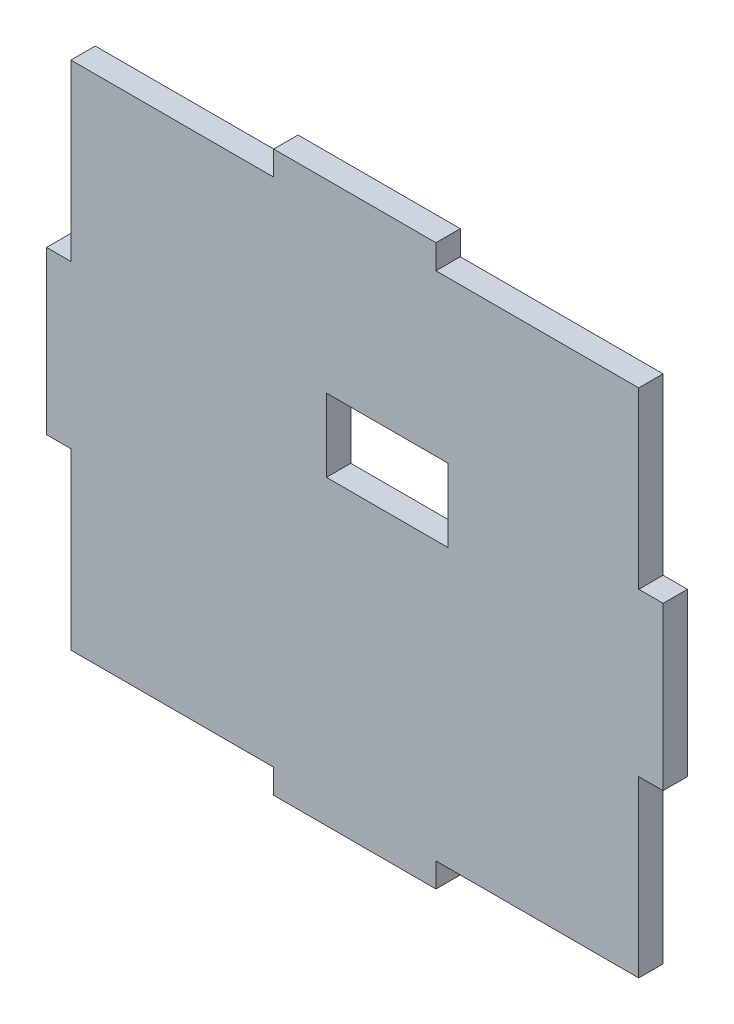
ISO-10303-21;
HEADER;
FILE_DESCRIPTION(('STEP AP214'),'2;1');
FILE_NAME('part.step','',(''),(''),'','','');
FILE_SCHEMA(('AUTOMOTIVE_DESIGN { 1 0 10303 214 1 1 1 1 }'));
ENDSEC;
DATA;
#1=APPLICATION_CONTEXT('core data for automotive mechanical design processes');
#2=APPLICATION_PROTOCOL_DEFINITION('international standard','automotive_design',2000,#1);
#3=PRODUCT_CONTEXT('',#1,'mechanical');
#4=PRODUCT('Part','Part','',(#3));
#5=PRODUCT_RELATED_PRODUCT_CATEGORY('part','',(#4));
#6=PRODUCT_DEFINITION_FORMATION('','',#4);
#7=PRODUCT_DEFINITION_CONTEXT('part definition',#1,'design');
#8=PRODUCT_DEFINITION('design','',#6,#7);
#9=PRODUCT_DEFINITION_SHAPE('','',#8);
#10=(LENGTH_UNIT() NAMED_UNIT(*) SI_UNIT(.MILLI.,.METRE.));
#11=(NAMED_UNIT(*) PLANE_ANGLE_UNIT() SI_UNIT($,.RADIAN.));
#12=(NAMED_UNIT(*) SI_UNIT($,.STERADIAN.) SOLID_ANGLE_UNIT());
#13=UNCERTAINTY_MEASURE_WITH_UNIT(LENGTH_MEASURE(1.E-05),#10,'distance_accuracy_value','');
#14=(GEOMETRIC_REPRESENTATION_CONTEXT(3) GLOBAL_UNCERTAINTY_ASSIGNED_CONTEXT((#13)) GLOBAL_UNIT_ASSIGNED_CONTEXT((#10,
#11,#12)) REPRESENTATION_CONTEXT('',''));
#15=CARTESIAN_POINT('',(0.,0.,0.));
#16=DIRECTION('',(0.,0.,1.));
#17=DIRECTION('',(1.,0.,0.));
#18=AXIS2_PLACEMENT_3D('',#15,#16,#17);
#19=CARTESIAN_POINT('',(-35.,-31.5,3.));
#20=DIRECTION('',(0.,1.,0.));
#21=DIRECTION('',(0.,0.,1.));
#22=AXIS2_PLACEMENT_3D('',#19,#20,#21);
#23=PLANE('',#22);
#24=DIRECTION('',(0.,0.,1.));
#25=VECTOR('',#24,1.);
#26=CARTESIAN_POINT('',(10.,-31.5,-20.2237484161567));
#27=LINE('',#26,#25);
#28=CARTESIAN_POINT('',(10.,-31.5,0.));
#29=VERTEX_POINT('',#28);
#30=CARTESIAN_POINT('',(10.,-31.5,3.));
#31=VERTEX_POINT('',#30);
#32=EDGE_CURVE('E58',#29,#31,#27,.T.);
#33=ORIENTED_EDGE('',*,*,#32,.F.);
#34=DIRECTION('',(1.,0.,0.));
#35=VECTOR('',#34,1.);
#36=CARTESIAN_POINT('',(-35.,-31.5,0.));
#37=LINE('',#36,#35);
#38=CARTESIAN_POINT('',(35.,-31.5,0.));
#39=VERTEX_POINT('',#38);
#40=EDGE_CURVE('E281',#29,#39,#37,.T.);
#41=ORIENTED_EDGE('',*,*,#40,.T.);
#42=DIRECTION('',(0.,0.,-1.));
#43=VECTOR('',#42,1.);
#44=CARTESIAN_POINT('',(35.,-31.5,3.));
#45=LINE('',#44,#43);
#46=CARTESIAN_POINT('',(35.,-31.5,3.));
#47=VERTEX_POINT('',#46);
#48=EDGE_CURVE('E287',#47,#39,#45,.T.);
#49=ORIENTED_EDGE('',*,*,#48,.F.);
#50=DIRECTION('',(1.,0.,0.));
#51=VECTOR('',#50,1.);
#52=CARTESIAN_POINT('',(-35.,-31.5,3.));
#53=LINE('',#52,#51);
#54=EDGE_CURVE('E234',#31,#47,#53,.T.);
#55=ORIENTED_EDGE('',*,*,#54,.F.);
#56=EDGE_LOOP('',(#33,#41,#49,#55));
#57=FACE_BOUND('',#56,.T.);
#58=ADVANCED_FACE('F33',(#57),#23,.F.);
#59=CARTESIAN_POINT('',(-35.,31.5,3.));
#60=DIRECTION('',(0.,-1.,0.));
#61=DIRECTION('',(0.,0.,-1.));
#62=AXIS2_PLACEMENT_3D('',#59,#60,#61);
#63=PLANE('',#62);
#64=DIRECTION('',(0.,0.,1.));
#65=VECTOR('',#64,1.);
#66=CARTESIAN_POINT('',(-9.99999999999999,31.5,-20.2237484161567));
#67=LINE('',#66,#65);
#68=CARTESIAN_POINT('',(-9.99999999999999,31.5,0.));
#69=VERTEX_POINT('',#68);
#70=CARTESIAN_POINT('',(-9.99999999999999,31.5,3.));
#71=VERTEX_POINT('',#70);
#72=EDGE_CURVE('E258',#69,#71,#67,.T.);
#73=ORIENTED_EDGE('',*,*,#72,.F.);
#74=DIRECTION('',(-1.,0.,0.));
#75=VECTOR('',#74,1.);
#76=CARTESIAN_POINT('',(-35.,31.5,0.));
#77=LINE('',#76,#75);
#78=CARTESIAN_POINT('',(-35.,31.5,0.));
#79=VERTEX_POINT('',#78);
#80=EDGE_CURVE('E299',#69,#79,#77,.T.);
#81=ORIENTED_EDGE('',*,*,#80,.T.);
#82=DIRECTION('',(0.,0.,-1.));
#83=VECTOR('',#82,1.);
#84=CARTESIAN_POINT('',(-35.,31.5,3.));
#85=LINE('',#84,#83);
#86=CARTESIAN_POINT('',(-35.,31.5,3.));
#87=VERTEX_POINT('',#86);
#88=EDGE_CURVE('E42',#87,#79,#85,.T.);
#89=ORIENTED_EDGE('',*,*,#88,.F.);
#90=DIRECTION('',(-1.,0.,0.));
#91=VECTOR('',#90,1.);
#92=CARTESIAN_POINT('',(-35.,31.5,3.));
#93=LINE('',#92,#91);
#94=EDGE_CURVE('E370',#71,#87,#93,.T.);
#95=ORIENTED_EDGE('',*,*,#94,.F.);
#96=EDGE_LOOP('',(#73,#81,#89,#95));
#97=FACE_BOUND('',#96,.T.);
#98=ADVANCED_FACE('F448',(#97),#63,.F.);
#99=CARTESIAN_POINT('',(-35.,31.5,3.));
#100=DIRECTION('',(1.,0.,0.));
#101=DIRECTION('',(0.,1.,0.));
#102=AXIS2_PLACEMENT_3D('',#99,#100,#101);
#103=PLANE('',#102);
#104=DIRECTION('',(0.,0.,1.));
#105=VECTOR('',#104,1.);
#106=CARTESIAN_POINT('',(-35.,-10.,-20.2237484161567));
#107=LINE('',#106,#105);
#108=CARTESIAN_POINT('',(-35.,-10.,0.));
#109=VERTEX_POINT('',#108);
#110=CARTESIAN_POINT('',(-35.,-10.,3.));
#111=VERTEX_POINT('',#110);
#112=EDGE_CURVE('E325',#109,#111,#107,.T.);
#113=ORIENTED_EDGE('',*,*,#112,.F.);
#114=DIRECTION('',(0.,-1.,0.));
#115=VECTOR('',#114,1.);
#116=CARTESIAN_POINT('',(-35.,31.5,0.));
#117=LINE('',#116,#115);
#118=CARTESIAN_POINT('',(-35.,-31.5,0.));
#119=VERTEX_POINT('',#118);
#120=EDGE_CURVE('E313',#109,#119,#117,.T.);
#121=ORIENTED_EDGE('',*,*,#120,.T.);
#122=DIRECTION('',(0.,0.,-1.));
#123=VECTOR('',#122,1.);
#124=CARTESIAN_POINT('',(-35.,-31.5,3.));
#125=LINE('',#124,#123);
#126=CARTESIAN_POINT('',(-35.,-31.5,3.));
#127=VERTEX_POINT('',#126);
#128=EDGE_CURVE('E291',#127,#119,#125,.T.);
#129=ORIENTED_EDGE('',*,*,#128,.F.);
#130=DIRECTION('',(0.,-1.,0.));
#131=VECTOR('',#130,1.);
#132=CARTESIAN_POINT('',(-35.,31.5,3.));
#133=LINE('',#132,#131);
#134=EDGE_CURVE('E339',#111,#127,#133,.T.);
#135=ORIENTED_EDGE('',*,*,#134,.F.);
#136=EDGE_LOOP('',(#113,#121,#129,#135));
#137=FACE_BOUND('',#136,.T.);
#138=ADVANCED_FACE('F426',(#137),#103,.F.);
#139=CARTESIAN_POINT('',(35.,31.5,3.));
#140=DIRECTION('',(-1.,0.,0.));
#141=DIRECTION('',(0.,-1.,0.));
#142=AXIS2_PLACEMENT_3D('',#139,#140,#141);
#143=PLANE('',#142);
#144=DIRECTION('',(0.,0.,1.));
#145=VECTOR('',#144,1.);
#146=CARTESIAN_POINT('',(35.,10.,-20.2237484161567));
#147=LINE('',#146,#145);
#148=CARTESIAN_POINT('',(35.,10.,0.));
#149=VERTEX_POINT('',#148);
#150=CARTESIAN_POINT('',(35.,10.,3.));
#151=VERTEX_POINT('',#150);
#152=EDGE_CURVE('E395',#149,#151,#147,.T.);
#153=ORIENTED_EDGE('',*,*,#152,.F.);
#154=DIRECTION('',(0.,1.,0.));
#155=VECTOR('',#154,1.);
#156=CARTESIAN_POINT('',(35.,31.5,0.));
#157=LINE('',#156,#155);
#158=CARTESIAN_POINT('',(35.,31.5,0.));
#159=VERTEX_POINT('',#158);
#160=EDGE_CURVE('E300',#149,#159,#157,.T.);
#161=ORIENTED_EDGE('',*,*,#160,.T.);
#162=DIRECTION('',(0.,0.,-1.));
#163=VECTOR('',#162,1.);
#164=CARTESIAN_POINT('',(35.,31.5,3.));
#165=LINE('',#164,#163);
#166=CARTESIAN_POINT('',(35.,31.5,3.));
#167=VERTEX_POINT('',#166);
#168=EDGE_CURVE('E11',#167,#159,#165,.T.);
#169=ORIENTED_EDGE('',*,*,#168,.F.);
#170=DIRECTION('',(0.,1.,0.));
#171=VECTOR('',#170,1.);
#172=CARTESIAN_POINT('',(35.,31.5,3.));
#173=LINE('',#172,#171);
#174=EDGE_CURVE('E280',#151,#167,#173,.T.);
#175=ORIENTED_EDGE('',*,*,#174,.F.);
#176=EDGE_LOOP('',(#153,#161,#169,#175));
#177=FACE_BOUND('',#176,.T.);
#178=ADVANCED_FACE('F465',(#177),#143,.F.);
#179=CARTESIAN_POINT('',(35.,-9.99999999999999,0.));
#180=VERTEX_POINT('',#179);
#181=EDGE_CURVE('E296',#39,#180,#157,.T.);
#182=ORIENTED_EDGE('',*,*,#181,.T.);
#183=DIRECTION('',(0.,0.,1.));
#184=VECTOR('',#183,1.);
#185=CARTESIAN_POINT('',(35.,-10.,-20.2237484161567));
#186=LINE('',#185,#184);
#187=CARTESIAN_POINT('',(35.,-9.99999999999999,3.));
#188=VERTEX_POINT('',#187);
#189=EDGE_CURVE('E410',#180,#188,#186,.T.);
#190=ORIENTED_EDGE('',*,*,#189,.T.);
#191=EDGE_CURVE('E389',#47,#188,#173,.T.);
#192=ORIENTED_EDGE('',*,*,#191,.F.);
#193=ORIENTED_EDGE('',*,*,#48,.T.);
#194=EDGE_LOOP('',(#182,#190,#192,#193));
#195=FACE_BOUND('',#194,.T.);
#196=ADVANCED_FACE('F35',(#195),#143,.F.);
#197=CARTESIAN_POINT('',(10.,31.5,0.));
#198=VERTEX_POINT('',#197);
#199=EDGE_CURVE('E311',#159,#198,#77,.T.);
#200=ORIENTED_EDGE('',*,*,#199,.T.);
#201=DIRECTION('',(0.,0.,1.));
#202=VECTOR('',#201,1.);
#203=CARTESIAN_POINT('',(10.,31.5,-20.2237484161567));
#204=LINE('',#203,#202);
#205=CARTESIAN_POINT('',(10.,31.5,3.));
#206=VERTEX_POINT('',#205);
#207=EDGE_CURVE('E263',#198,#206,#204,.T.);
#208=ORIENTED_EDGE('',*,*,#207,.T.);
#209=EDGE_CURVE('E373',#167,#206,#93,.T.);
#210=ORIENTED_EDGE('',*,*,#209,.F.);
#211=ORIENTED_EDGE('',*,*,#168,.T.);
#212=EDGE_LOOP('',(#200,#208,#210,#211));
#213=FACE_BOUND('',#212,.T.);
#214=ADVANCED_FACE('F453',(#213),#63,.F.);
#215=CARTESIAN_POINT('',(-35.,9.99999999999999,0.));
#216=VERTEX_POINT('',#215);
#217=EDGE_CURVE('E422',#79,#216,#117,.T.);
#218=ORIENTED_EDGE('',*,*,#217,.T.);
#219=DIRECTION('',(0.,0.,1.));
#220=VECTOR('',#219,1.);
#221=CARTESIAN_POINT('',(-35.,10.,-20.2237484161567));
#222=LINE('',#221,#220);
#223=CARTESIAN_POINT('',(-35.,9.99999999999999,3.));
#224=VERTEX_POINT('',#223);
#225=EDGE_CURVE('E321',#216,#224,#222,.T.);
#226=ORIENTED_EDGE('',*,*,#225,.T.);
#227=EDGE_CURVE('E369',#87,#224,#133,.T.);
#228=ORIENTED_EDGE('',*,*,#227,.F.);
#229=ORIENTED_EDGE('',*,*,#88,.T.);
#230=EDGE_LOOP('',(#218,#226,#228,#229));
#231=FACE_BOUND('',#230,.T.);
#232=ADVANCED_FACE('F456',(#231),#103,.F.);
#233=CARTESIAN_POINT('',(-10.,-31.5,0.));
#234=VERTEX_POINT('',#233);
#235=EDGE_CURVE('E277',#119,#234,#37,.T.);
#236=ORIENTED_EDGE('',*,*,#235,.T.);
#237=DIRECTION('',(0.,0.,1.));
#238=VECTOR('',#237,1.);
#239=CARTESIAN_POINT('',(-10.,-31.5,-20.2237484161567));
#240=LINE('',#239,#238);
#241=CARTESIAN_POINT('',(-10.,-31.5,3.));
#242=VERTEX_POINT('',#241);
#243=EDGE_CURVE('E50',#234,#242,#240,.T.);
#244=ORIENTED_EDGE('',*,*,#243,.T.);
#245=EDGE_CURVE('E220',#127,#242,#53,.T.);
#246=ORIENTED_EDGE('',*,*,#245,.F.);
#247=ORIENTED_EDGE('',*,*,#128,.T.);
#248=EDGE_LOOP('',(#236,#244,#246,#247));
#249=FACE_BOUND('',#248,.T.);
#250=ADVANCED_FACE('F428',(#249),#23,.F.);
#251=CARTESIAN_POINT('',(0.,0.,3.));
#252=DIRECTION('',(0.,0.,1.));
#253=DIRECTION('',(1.,0.,0.));
#254=AXIS2_PLACEMENT_3D('',#251,#252,#253);
#255=PLANE('',#254);
#256=DIRECTION('',(0.,1.,0.));
#257=VECTOR('',#256,1.);
#258=CARTESIAN_POINT('',(11.5,11.7,3.));
#259=LINE('',#258,#257);
#260=CARTESIAN_POINT('',(11.5,2.70000000000001,3.));
#261=VERTEX_POINT('',#260);
#262=CARTESIAN_POINT('',(11.5,11.7,3.));
#263=VERTEX_POINT('',#262);
#264=EDGE_CURVE('E489',#261,#263,#259,.T.);
#265=ORIENTED_EDGE('',*,*,#264,.F.);
#266=DIRECTION('',(1.,0.,0.));
#267=VECTOR('',#266,1.);
#268=CARTESIAN_POINT('',(-3.5,2.70000000000001,3.));
#269=LINE('',#268,#267);
#270=CARTESIAN_POINT('',(-3.5,2.70000000000001,3.));
#271=VERTEX_POINT('',#270);
#272=EDGE_CURVE('E569',#271,#261,#269,.T.);
#273=ORIENTED_EDGE('',*,*,#272,.F.);
#274=DIRECTION('',(0.,-1.,0.));
#275=VECTOR('',#274,1.);
#276=CARTESIAN_POINT('',(-3.5,11.7,3.));
#277=LINE('',#276,#275);
#278=CARTESIAN_POINT('',(-3.5,11.7,3.));
#279=VERTEX_POINT('',#278);
#280=EDGE_CURVE('E564',#279,#271,#277,.T.);
#281=ORIENTED_EDGE('',*,*,#280,.F.);
#282=DIRECTION('',(-1.,0.,0.));
#283=VECTOR('',#282,1.);
#284=CARTESIAN_POINT('',(-3.5,11.7,3.));
#285=LINE('',#284,#283);
#286=EDGE_CURVE('E557',#263,#279,#285,.T.);
#287=ORIENTED_EDGE('',*,*,#286,.F.);
#288=EDGE_LOOP('',(#265,#273,#281,#287));
#289=FACE_BOUND('',#288,.T.);
#290=ORIENTED_EDGE('',*,*,#191,.T.);
#291=DIRECTION('',(1.,0.,0.));
#292=VECTOR('',#291,1.);
#293=CARTESIAN_POINT('',(38.,-10.,3.));
#294=LINE('',#293,#292);
#295=CARTESIAN_POINT('',(38.,-10.,3.));
#296=VERTEX_POINT('',#295);
#297=EDGE_CURVE('E348',#188,#296,#294,.T.);
#298=ORIENTED_EDGE('',*,*,#297,.T.);
#299=DIRECTION('',(0.,1.,0.));
#300=VECTOR('',#299,1.);
#301=CARTESIAN_POINT('',(38.,10.,3.));
#302=LINE('',#301,#300);
#303=CARTESIAN_POINT('',(38.,10.,3.));
#304=VERTEX_POINT('',#303);
#305=EDGE_CURVE('E406',#296,#304,#302,.T.);
#306=ORIENTED_EDGE('',*,*,#305,.T.);
#307=DIRECTION('',(-1.,0.,0.));
#308=VECTOR('',#307,1.);
#309=CARTESIAN_POINT('',(38.,10.,3.));
#310=LINE('',#309,#308);
#311=EDGE_CURVE('E401',#304,#151,#310,.T.);
#312=ORIENTED_EDGE('',*,*,#311,.T.);
#313=ORIENTED_EDGE('',*,*,#174,.T.);
#314=ORIENTED_EDGE('',*,*,#209,.T.);
#315=DIRECTION('',(0.,1.,0.));
#316=VECTOR('',#315,1.);
#317=CARTESIAN_POINT('',(10.,34.5,3.));
#318=LINE('',#317,#316);
#319=CARTESIAN_POINT('',(10.,34.5,3.));
#320=VERTEX_POINT('',#319);
#321=EDGE_CURVE('E248',#206,#320,#318,.T.);
#322=ORIENTED_EDGE('',*,*,#321,.T.);
#323=DIRECTION('',(-1.,0.,0.));
#324=VECTOR('',#323,1.);
#325=CARTESIAN_POINT('',(10.,34.5,3.));
#326=LINE('',#325,#324);
#327=CARTESIAN_POINT('',(-9.99999999999999,34.5,3.));
#328=VERTEX_POINT('',#327);
#329=EDGE_CURVE('E255',#320,#328,#326,.T.);
#330=ORIENTED_EDGE('',*,*,#329,.T.);
#331=DIRECTION('',(0.,-1.,0.));
#332=VECTOR('',#331,1.);
#333=CARTESIAN_POINT('',(-9.99999999999999,34.5,3.));
#334=LINE('',#333,#332);
#335=EDGE_CURVE('E245',#328,#71,#334,.T.);
#336=ORIENTED_EDGE('',*,*,#335,.T.);
#337=ORIENTED_EDGE('',*,*,#94,.T.);
#338=ORIENTED_EDGE('',*,*,#227,.T.);
#339=DIRECTION('',(-1.,0.,0.));
#340=VECTOR('',#339,1.);
#341=CARTESIAN_POINT('',(-35.,10.,3.));
#342=LINE('',#341,#340);
#343=CARTESIAN_POINT('',(-38.,9.99999999999999,3.));
#344=VERTEX_POINT('',#343);
#345=EDGE_CURVE('E316',#224,#344,#342,.T.);
#346=ORIENTED_EDGE('',*,*,#345,.T.);
#347=DIRECTION('',(0.,-1.,0.));
#348=VECTOR('',#347,1.);
#349=CARTESIAN_POINT('',(-38.,9.99999999999999,3.));
#350=LINE('',#349,#348);
#351=CARTESIAN_POINT('',(-38.,-10.,3.));
#352=VERTEX_POINT('',#351);
#353=EDGE_CURVE('E343',#344,#352,#350,.T.);
#354=ORIENTED_EDGE('',*,*,#353,.T.);
#355=DIRECTION('',(1.,0.,0.));
#356=VECTOR('',#355,1.);
#357=CARTESIAN_POINT('',(-35.,-10.,3.));
#358=LINE('',#357,#356);
#359=EDGE_CURVE('E320',#352,#111,#358,.T.);
#360=ORIENTED_EDGE('',*,*,#359,.T.);
#361=ORIENTED_EDGE('',*,*,#134,.T.);
#362=ORIENTED_EDGE('',*,*,#245,.T.);
#363=DIRECTION('',(0.,-1.,0.));
#364=VECTOR('',#363,1.);
#365=CARTESIAN_POINT('',(-10.,-31.5,3.));
#366=LINE('',#365,#364);
#367=CARTESIAN_POINT('',(-10.,-34.5,3.));
#368=VERTEX_POINT('',#367);
#369=EDGE_CURVE('E202',#242,#368,#366,.T.);
#370=ORIENTED_EDGE('',*,*,#369,.T.);
#371=DIRECTION('',(1.,0.,0.));
#372=VECTOR('',#371,1.);
#373=CARTESIAN_POINT('',(10.,-34.5,3.));
#374=LINE('',#373,#372);
#375=CARTESIAN_POINT('',(10.,-34.5,3.));
#376=VERTEX_POINT('',#375);
#377=EDGE_CURVE('E211',#368,#376,#374,.T.);
#378=ORIENTED_EDGE('',*,*,#377,.T.);
#379=DIRECTION('',(0.,1.,0.));
#380=VECTOR('',#379,1.);
#381=CARTESIAN_POINT('',(10.,-31.5,3.));
#382=LINE('',#381,#380);
#383=EDGE_CURVE('E208',#376,#31,#382,.T.);
#384=ORIENTED_EDGE('',*,*,#383,.T.);
#385=ORIENTED_EDGE('',*,*,#54,.T.);
#386=EDGE_LOOP('',(#290,#298,#306,#312,#313,#314,#322,#330,#336,#337,#338,#346,#354,#360,#361,
#362,#370,#378,#384,#385));
#387=FACE_BOUND('',#386,.T.);
#388=ADVANCED_FACE('F219',(#289,#387),#255,.T.);
#389=CARTESIAN_POINT('',(0.,0.,0.));
#390=DIRECTION('',(0.,0.,1.));
#391=DIRECTION('',(1.,0.,0.));
#392=AXIS2_PLACEMENT_3D('',#389,#390,#391);
#393=PLANE('',#392);
#394=DIRECTION('',(1.,0.,0.));
#395=VECTOR('',#394,1.);
#396=CARTESIAN_POINT('',(-3.5,2.70000000000001,0.));
#397=LINE('',#396,#395);
#398=CARTESIAN_POINT('',(-3.5,2.70000000000001,0.));
#399=VERTEX_POINT('',#398);
#400=CARTESIAN_POINT('',(11.5,2.70000000000001,0.));
#401=VERTEX_POINT('',#400);
#402=EDGE_CURVE('E577',#399,#401,#397,.T.);
#403=ORIENTED_EDGE('',*,*,#402,.T.);
#404=DIRECTION('',(0.,1.,0.));
#405=VECTOR('',#404,1.);
#406=CARTESIAN_POINT('',(11.5,11.7,0.));
#407=LINE('',#406,#405);
#408=CARTESIAN_POINT('',(11.5,11.7,0.));
#409=VERTEX_POINT('',#408);
#410=EDGE_CURVE('E413',#401,#409,#407,.T.);
#411=ORIENTED_EDGE('',*,*,#410,.T.);
#412=DIRECTION('',(-1.,0.,0.));
#413=VECTOR('',#412,1.);
#414=CARTESIAN_POINT('',(-3.5,11.7,0.));
#415=LINE('',#414,#413);
#416=CARTESIAN_POINT('',(-3.5,11.7,0.));
#417=VERTEX_POINT('',#416);
#418=EDGE_CURVE('E583',#409,#417,#415,.T.);
#419=ORIENTED_EDGE('',*,*,#418,.T.);
#420=DIRECTION('',(0.,-1.,0.));
#421=VECTOR('',#420,1.);
#422=CARTESIAN_POINT('',(-3.5,11.7,0.));
#423=LINE('',#422,#421);
#424=EDGE_CURVE('E578',#417,#399,#423,.T.);
#425=ORIENTED_EDGE('',*,*,#424,.T.);
#426=EDGE_LOOP('',(#403,#411,#419,#425));
#427=FACE_BOUND('',#426,.T.);
#428=ORIENTED_EDGE('',*,*,#181,.F.);
#429=ORIENTED_EDGE('',*,*,#40,.F.);
#430=DIRECTION('',(0.,-1.,0.));
#431=VECTOR('',#430,1.);
#432=CARTESIAN_POINT('',(10.,-31.5,0.));
#433=LINE('',#432,#431);
#434=CARTESIAN_POINT('',(10.,-34.5,0.));
#435=VERTEX_POINT('',#434);
#436=EDGE_CURVE('E224',#29,#435,#433,.T.);
#437=ORIENTED_EDGE('',*,*,#436,.T.);
#438=DIRECTION('',(-1.,0.,0.));
#439=VECTOR('',#438,1.);
#440=CARTESIAN_POINT('',(10.,-34.5,0.));
#441=LINE('',#440,#439);
#442=CARTESIAN_POINT('',(-10.,-34.5,0.));
#443=VERTEX_POINT('',#442);
#444=EDGE_CURVE('E242',#435,#443,#441,.T.);
#445=ORIENTED_EDGE('',*,*,#444,.T.);
#446=DIRECTION('',(0.,1.,0.));
#447=VECTOR('',#446,1.);
#448=CARTESIAN_POINT('',(-10.,-31.5,0.));
#449=LINE('',#448,#447);
#450=EDGE_CURVE('E204',#443,#234,#449,.T.);
#451=ORIENTED_EDGE('',*,*,#450,.T.);
#452=ORIENTED_EDGE('',*,*,#235,.F.);
#453=ORIENTED_EDGE('',*,*,#120,.F.);
#454=DIRECTION('',(-1.,0.,0.));
#455=VECTOR('',#454,1.);
#456=CARTESIAN_POINT('',(-35.,-10.,0.));
#457=LINE('',#456,#455);
#458=CARTESIAN_POINT('',(-38.,-10.,0.));
#459=VERTEX_POINT('',#458);
#460=EDGE_CURVE('E346',#109,#459,#457,.T.);
#461=ORIENTED_EDGE('',*,*,#460,.T.);
#462=DIRECTION('',(0.,1.,0.));
#463=VECTOR('',#462,1.);
#464=CARTESIAN_POINT('',(-38.,9.99999999999999,0.));
#465=LINE('',#464,#463);
#466=CARTESIAN_POINT('',(-38.,9.99999999999999,0.));
#467=VERTEX_POINT('',#466);
#468=EDGE_CURVE('E349',#459,#467,#465,.T.);
#469=ORIENTED_EDGE('',*,*,#468,.T.);
#470=DIRECTION('',(1.,0.,0.));
#471=VECTOR('',#470,1.);
#472=CARTESIAN_POINT('',(-35.,10.,0.));
#473=LINE('',#472,#471);
#474=EDGE_CURVE('E351',#467,#216,#473,.T.);
#475=ORIENTED_EDGE('',*,*,#474,.T.);
#476=ORIENTED_EDGE('',*,*,#217,.F.);
#477=ORIENTED_EDGE('',*,*,#80,.F.);
#478=DIRECTION('',(0.,1.,0.));
#479=VECTOR('',#478,1.);
#480=CARTESIAN_POINT('',(-9.99999999999999,34.5,0.));
#481=LINE('',#480,#479);
#482=CARTESIAN_POINT('',(-9.99999999999999,34.5,0.));
#483=VERTEX_POINT('',#482);
#484=EDGE_CURVE('E253',#69,#483,#481,.T.);
#485=ORIENTED_EDGE('',*,*,#484,.T.);
#486=DIRECTION('',(1.,0.,0.));
#487=VECTOR('',#486,1.);
#488=CARTESIAN_POINT('',(10.,34.5,0.));
#489=LINE('',#488,#487);
#490=CARTESIAN_POINT('',(10.,34.5,0.));
#491=VERTEX_POINT('',#490);
#492=EDGE_CURVE('E251',#483,#491,#489,.T.);
#493=ORIENTED_EDGE('',*,*,#492,.T.);
#494=DIRECTION('',(0.,-1.,0.));
#495=VECTOR('',#494,1.);
#496=CARTESIAN_POINT('',(10.,34.5,0.));
#497=LINE('',#496,#495);
#498=EDGE_CURVE('E254',#491,#198,#497,.T.);
#499=ORIENTED_EDGE('',*,*,#498,.T.);
#500=ORIENTED_EDGE('',*,*,#199,.F.);
#501=ORIENTED_EDGE('',*,*,#160,.F.);
#502=DIRECTION('',(1.,0.,0.));
#503=VECTOR('',#502,1.);
#504=CARTESIAN_POINT('',(38.,10.,0.));
#505=LINE('',#504,#503);
#506=CARTESIAN_POINT('',(38.,10.,0.));
#507=VERTEX_POINT('',#506);
#508=EDGE_CURVE('E481',#149,#507,#505,.T.);
#509=ORIENTED_EDGE('',*,*,#508,.T.);
#510=DIRECTION('',(0.,-1.,0.));
#511=VECTOR('',#510,1.);
#512=CARTESIAN_POINT('',(38.,10.,0.));
#513=LINE('',#512,#511);
#514=CARTESIAN_POINT('',(38.,-10.,0.));
#515=VERTEX_POINT('',#514);
#516=EDGE_CURVE('E399',#507,#515,#513,.T.);
#517=ORIENTED_EDGE('',*,*,#516,.T.);
#518=DIRECTION('',(-1.,0.,0.));
#519=VECTOR('',#518,1.);
#520=CARTESIAN_POINT('',(38.,-10.,0.));
#521=LINE('',#520,#519);
#522=EDGE_CURVE('E487',#515,#180,#521,.T.);
#523=ORIENTED_EDGE('',*,*,#522,.T.);
#524=EDGE_LOOP('',(#428,#429,#437,#445,#451,#452,#453,#461,#469,#475,#476,#477,#485,#493,#499,
#500,#501,#509,#517,#523));
#525=FACE_BOUND('',#524,.T.);
#526=ADVANCED_FACE('F430',(#427,#525),#393,.F.);
#527=CARTESIAN_POINT('',(11.5,11.7,0.));
#528=DIRECTION('',(1.,0.,0.));
#529=DIRECTION('',(0.,0.,-1.));
#530=AXIS2_PLACEMENT_3D('',#527,#528,#529);
#531=PLANE('',#530);
#532=ORIENTED_EDGE('',*,*,#264,.T.);
#533=DIRECTION('',(0.,0.,1.));
#534=VECTOR('',#533,1.);
#535=CARTESIAN_POINT('',(11.5,11.7,0.));
#536=LINE('',#535,#534);
#537=EDGE_CURVE('E562',#409,#263,#536,.T.);
#538=ORIENTED_EDGE('',*,*,#537,.F.);
#539=ORIENTED_EDGE('',*,*,#410,.F.);
#540=DIRECTION('',(0.,0.,1.));
#541=VECTOR('',#540,1.);
#542=CARTESIAN_POINT('',(11.5,2.70000000000001,0.));
#543=LINE('',#542,#541);
#544=EDGE_CURVE('E484',#401,#261,#543,.T.);
#545=ORIENTED_EDGE('',*,*,#544,.T.);
#546=EDGE_LOOP('',(#532,#538,#539,#545));
#547=FACE_BOUND('',#546,.T.);
#548=ADVANCED_FACE('F433',(#547),#531,.F.);
#549=CARTESIAN_POINT('',(-3.5,2.70000000000001,0.));
#550=DIRECTION('',(0.,-1.,0.));
#551=DIRECTION('',(0.,0.,-1.));
#552=AXIS2_PLACEMENT_3D('',#549,#550,#551);
#553=PLANE('',#552);
#554=ORIENTED_EDGE('',*,*,#272,.T.);
#555=ORIENTED_EDGE('',*,*,#544,.F.);
#556=ORIENTED_EDGE('',*,*,#402,.F.);
#557=DIRECTION('',(0.,0.,1.));
#558=VECTOR('',#557,1.);
#559=CARTESIAN_POINT('',(-3.5,2.70000000000001,0.));
#560=LINE('',#559,#558);
#561=EDGE_CURVE('E575',#399,#271,#560,.T.);
#562=ORIENTED_EDGE('',*,*,#561,.T.);
#563=EDGE_LOOP('',(#554,#555,#556,#562));
#564=FACE_BOUND('',#563,.T.);
#565=ADVANCED_FACE('F440',(#564),#553,.F.);
#566=CARTESIAN_POINT('',(-3.5,11.7,0.));
#567=DIRECTION('',(-1.,0.,0.));
#568=DIRECTION('',(0.,-1.,0.));
#569=AXIS2_PLACEMENT_3D('',#566,#567,#568);
#570=PLANE('',#569);
#571=ORIENTED_EDGE('',*,*,#280,.T.);
#572=ORIENTED_EDGE('',*,*,#561,.F.);
#573=ORIENTED_EDGE('',*,*,#424,.F.);
#574=DIRECTION('',(0.,0.,1.));
#575=VECTOR('',#574,1.);
#576=CARTESIAN_POINT('',(-3.5,11.7,0.));
#577=LINE('',#576,#575);
#578=EDGE_CURVE('E560',#417,#279,#577,.T.);
#579=ORIENTED_EDGE('',*,*,#578,.T.);
#580=EDGE_LOOP('',(#571,#572,#573,#579));
#581=FACE_BOUND('',#580,.T.);
#582=ADVANCED_FACE('F544',(#581),#570,.F.);
#583=CARTESIAN_POINT('',(-3.5,11.7,0.));
#584=DIRECTION('',(0.,1.,0.));
#585=DIRECTION('',(0.,0.,1.));
#586=AXIS2_PLACEMENT_3D('',#583,#584,#585);
#587=PLANE('',#586);
#588=ORIENTED_EDGE('',*,*,#286,.T.);
#589=ORIENTED_EDGE('',*,*,#578,.F.);
#590=ORIENTED_EDGE('',*,*,#418,.F.);
#591=ORIENTED_EDGE('',*,*,#537,.T.);
#592=EDGE_LOOP('',(#588,#589,#590,#591));
#593=FACE_BOUND('',#592,.T.);
#594=ADVANCED_FACE('F537',(#593),#587,.F.);
#595=CARTESIAN_POINT('',(38.,10.,-20.2237484161567));
#596=DIRECTION('',(0.,1.,0.));
#597=DIRECTION('',(-1.,0.,0.));
#598=AXIS2_PLACEMENT_3D('',#595,#596,#597);
#599=PLANE('',#598);
#600=ORIENTED_EDGE('',*,*,#508,.F.);
#601=ORIENTED_EDGE('',*,*,#152,.T.);
#602=ORIENTED_EDGE('',*,*,#311,.F.);
#603=DIRECTION('',(0.,0.,1.));
#604=VECTOR('',#603,1.);
#605=CARTESIAN_POINT('',(38.,10.,-20.2237484161567));
#606=LINE('',#605,#604);
#607=EDGE_CURVE('E400',#507,#304,#606,.T.);
#608=ORIENTED_EDGE('',*,*,#607,.F.);
#609=EDGE_LOOP('',(#600,#601,#602,#608));
#610=FACE_BOUND('',#609,.T.);
#611=ADVANCED_FACE('F486',(#610),#599,.T.);
#612=CARTESIAN_POINT('',(38.,10.,-20.2237484161567));
#613=DIRECTION('',(1.,0.,0.));
#614=DIRECTION('',(0.,0.,-1.));
#615=AXIS2_PLACEMENT_3D('',#612,#613,#614);
#616=PLANE('',#615);
#617=ORIENTED_EDGE('',*,*,#516,.F.);
#618=ORIENTED_EDGE('',*,*,#607,.T.);
#619=ORIENTED_EDGE('',*,*,#305,.F.);
#620=DIRECTION('',(0.,0.,1.));
#621=VECTOR('',#620,1.);
#622=CARTESIAN_POINT('',(38.,-10.,-20.2237484161567));
#623=LINE('',#622,#621);
#624=EDGE_CURVE('E408',#515,#296,#623,.T.);
#625=ORIENTED_EDGE('',*,*,#624,.F.);
#626=EDGE_LOOP('',(#617,#618,#619,#625));
#627=FACE_BOUND('',#626,.T.);
#628=ADVANCED_FACE('F498',(#627),#616,.T.);
#629=CARTESIAN_POINT('',(38.,-10.,-20.2237484161567));
#630=DIRECTION('',(0.,-1.,0.));
#631=DIRECTION('',(1.,0.,0.));
#632=AXIS2_PLACEMENT_3D('',#629,#630,#631);
#633=PLANE('',#632);
#634=ORIENTED_EDGE('',*,*,#522,.F.);
#635=ORIENTED_EDGE('',*,*,#624,.T.);
#636=ORIENTED_EDGE('',*,*,#297,.F.);
#637=ORIENTED_EDGE('',*,*,#189,.F.);
#638=EDGE_LOOP('',(#634,#635,#636,#637));
#639=FACE_BOUND('',#638,.T.);
#640=ADVANCED_FACE('F501',(#639),#633,.T.);
#641=CARTESIAN_POINT('',(-38.,9.99999999999999,-20.2237484161567));
#642=DIRECTION('',(-1.,0.,0.));
#643=DIRECTION('',(0.,0.,1.));
#644=AXIS2_PLACEMENT_3D('',#641,#642,#643);
#645=PLANE('',#644);
#646=ORIENTED_EDGE('',*,*,#468,.F.);
#647=DIRECTION('',(0.,0.,1.));
#648=VECTOR('',#647,1.);
#649=CARTESIAN_POINT('',(-38.,-10.,-20.2237484161567));
#650=LINE('',#649,#648);
#651=EDGE_CURVE('E319',#459,#352,#650,.T.);
#652=ORIENTED_EDGE('',*,*,#651,.T.);
#653=ORIENTED_EDGE('',*,*,#353,.F.);
#654=DIRECTION('',(0.,0.,1.));
#655=VECTOR('',#654,1.);
#656=CARTESIAN_POINT('',(-38.,9.99999999999999,-20.2237484161567));
#657=LINE('',#656,#655);
#658=EDGE_CURVE('E324',#467,#344,#657,.T.);
#659=ORIENTED_EDGE('',*,*,#658,.F.);
#660=EDGE_LOOP('',(#646,#652,#653,#659));
#661=FACE_BOUND('',#660,.T.);
#662=ADVANCED_FACE('F364',(#661),#645,.T.);
#663=CARTESIAN_POINT('',(-35.,10.,-20.2237484161567));
#664=DIRECTION('',(0.,1.,0.));
#665=DIRECTION('',(-1.,0.,0.));
#666=AXIS2_PLACEMENT_3D('',#663,#664,#665);
#667=PLANE('',#666);
#668=ORIENTED_EDGE('',*,*,#474,.F.);
#669=ORIENTED_EDGE('',*,*,#658,.T.);
#670=ORIENTED_EDGE('',*,*,#345,.F.);
#671=ORIENTED_EDGE('',*,*,#225,.F.);
#672=EDGE_LOOP('',(#668,#669,#670,#671));
#673=FACE_BOUND('',#672,.T.);
#674=ADVANCED_FACE('F360',(#673),#667,.T.);
#675=CARTESIAN_POINT('',(-35.,-10.,-20.2237484161567));
#676=DIRECTION('',(0.,-1.,0.));
#677=DIRECTION('',(0.,0.,-1.));
#678=AXIS2_PLACEMENT_3D('',#675,#676,#677);
#679=PLANE('',#678);
#680=ORIENTED_EDGE('',*,*,#460,.F.);
#681=ORIENTED_EDGE('',*,*,#112,.T.);
#682=ORIENTED_EDGE('',*,*,#359,.F.);
#683=ORIENTED_EDGE('',*,*,#651,.F.);
#684=EDGE_LOOP('',(#680,#681,#682,#683));
#685=FACE_BOUND('',#684,.T.);
#686=ADVANCED_FACE('F526',(#685),#679,.T.);
#687=CARTESIAN_POINT('',(-9.99999999999999,34.5,-20.2237484161567));
#688=DIRECTION('',(-1.,0.,0.));
#689=DIRECTION('',(0.,0.,1.));
#690=AXIS2_PLACEMENT_3D('',#687,#688,#689);
#691=PLANE('',#690);
#692=ORIENTED_EDGE('',*,*,#484,.F.);
#693=ORIENTED_EDGE('',*,*,#72,.T.);
#694=ORIENTED_EDGE('',*,*,#335,.F.);
#695=DIRECTION('',(0.,0.,1.));
#696=VECTOR('',#695,1.);
#697=CARTESIAN_POINT('',(-9.99999999999999,34.5,-20.2237484161567));
#698=LINE('',#697,#696);
#699=EDGE_CURVE('E259',#483,#328,#698,.T.);
#700=ORIENTED_EDGE('',*,*,#699,.F.);
#701=EDGE_LOOP('',(#692,#693,#694,#700));
#702=FACE_BOUND('',#701,.T.);
#703=ADVANCED_FACE('F519',(#702),#691,.T.);
#704=CARTESIAN_POINT('',(10.,34.5,-20.2237484161567));
#705=DIRECTION('',(0.,1.,0.));
#706=DIRECTION('',(-1.,0.,0.));
#707=AXIS2_PLACEMENT_3D('',#704,#705,#706);
#708=PLANE('',#707);
#709=ORIENTED_EDGE('',*,*,#492,.F.);
#710=ORIENTED_EDGE('',*,*,#699,.T.);
#711=ORIENTED_EDGE('',*,*,#329,.F.);
#712=DIRECTION('',(0.,0.,1.));
#713=VECTOR('',#712,1.);
#714=CARTESIAN_POINT('',(10.,34.5,-20.2237484161567));
#715=LINE('',#714,#713);
#716=EDGE_CURVE('E261',#491,#320,#715,.T.);
#717=ORIENTED_EDGE('',*,*,#716,.F.);
#718=EDGE_LOOP('',(#709,#710,#711,#717));
#719=FACE_BOUND('',#718,.T.);
#720=ADVANCED_FACE('F516',(#719),#708,.T.);
#721=CARTESIAN_POINT('',(10.,34.5,-20.2237484161567));
#722=DIRECTION('',(1.,0.,0.));
#723=DIRECTION('',(0.,0.,-1.));
#724=AXIS2_PLACEMENT_3D('',#721,#722,#723);
#725=PLANE('',#724);
#726=ORIENTED_EDGE('',*,*,#498,.F.);
#727=ORIENTED_EDGE('',*,*,#716,.T.);
#728=ORIENTED_EDGE('',*,*,#321,.F.);
#729=ORIENTED_EDGE('',*,*,#207,.F.);
#730=EDGE_LOOP('',(#726,#727,#728,#729));
#731=FACE_BOUND('',#730,.T.);
#732=ADVANCED_FACE('F513',(#731),#725,.T.);
#733=CARTESIAN_POINT('',(-10.,-31.5,-20.2237484161567));
#734=DIRECTION('',(-1.,0.,0.));
#735=DIRECTION('',(0.,0.,1.));
#736=AXIS2_PLACEMENT_3D('',#733,#734,#735);
#737=PLANE('',#736);
#738=ORIENTED_EDGE('',*,*,#450,.F.);
#739=DIRECTION('',(0.,0.,1.));
#740=VECTOR('',#739,1.);
#741=CARTESIAN_POINT('',(-10.,-34.5,-20.2237484161567));
#742=LINE('',#741,#740);
#743=EDGE_CURVE('E198',#443,#368,#742,.T.);
#744=ORIENTED_EDGE('',*,*,#743,.T.);
#745=ORIENTED_EDGE('',*,*,#369,.F.);
#746=ORIENTED_EDGE('',*,*,#243,.F.);
#747=EDGE_LOOP('',(#738,#744,#745,#746));
#748=FACE_BOUND('',#747,.T.);
#749=ADVANCED_FACE('F200',(#748),#737,.T.);
#750=CARTESIAN_POINT('',(10.,-31.5,-20.2237484161567));
#751=DIRECTION('',(1.,0.,0.));
#752=DIRECTION('',(0.,0.,-1.));
#753=AXIS2_PLACEMENT_3D('',#750,#751,#752);
#754=PLANE('',#753);
#755=ORIENTED_EDGE('',*,*,#436,.F.);
#756=ORIENTED_EDGE('',*,*,#32,.T.);
#757=ORIENTED_EDGE('',*,*,#383,.F.);
#758=DIRECTION('',(0.,0.,1.));
#759=VECTOR('',#758,1.);
#760=CARTESIAN_POINT('',(10.,-34.5,-20.2237484161567));
#761=LINE('',#760,#759);
#762=EDGE_CURVE('E207',#435,#376,#761,.T.);
#763=ORIENTED_EDGE('',*,*,#762,.F.);
#764=EDGE_LOOP('',(#755,#756,#757,#763));
#765=FACE_BOUND('',#764,.T.);
#766=ADVANCED_FACE('F505',(#765),#754,.T.);
#767=CARTESIAN_POINT('',(10.,-34.5,-20.2237484161567));
#768=DIRECTION('',(0.,-1.,0.));
#769=DIRECTION('',(1.,0.,0.));
#770=AXIS2_PLACEMENT_3D('',#767,#768,#769);
#771=PLANE('',#770);
#772=ORIENTED_EDGE('',*,*,#444,.F.);
#773=ORIENTED_EDGE('',*,*,#762,.T.);
#774=ORIENTED_EDGE('',*,*,#377,.F.);
#775=ORIENTED_EDGE('',*,*,#743,.F.);
#776=EDGE_LOOP('',(#772,#773,#774,#775));
#777=FACE_BOUND('',#776,.T.);
#778=ADVANCED_FACE('F212',(#777),#771,.T.);
#779=CLOSED_SHELL('',(#58,#98,#138,#178,#196,#214,#232,#250,#388,#526,#548,#565,#582,#594,#611,
#628,#640,#662,#674,#686,#703,#720,#732,#749,#766,#778));
#780=MANIFOLD_SOLID_BREP('B2',#779);
#781=ADVANCED_BREP_SHAPE_REPRESENTATION('',(#18,#780),#14);
#782=SHAPE_DEFINITION_REPRESENTATION(#9,#781);
ENDSEC;
END-ISO-10303-21;
